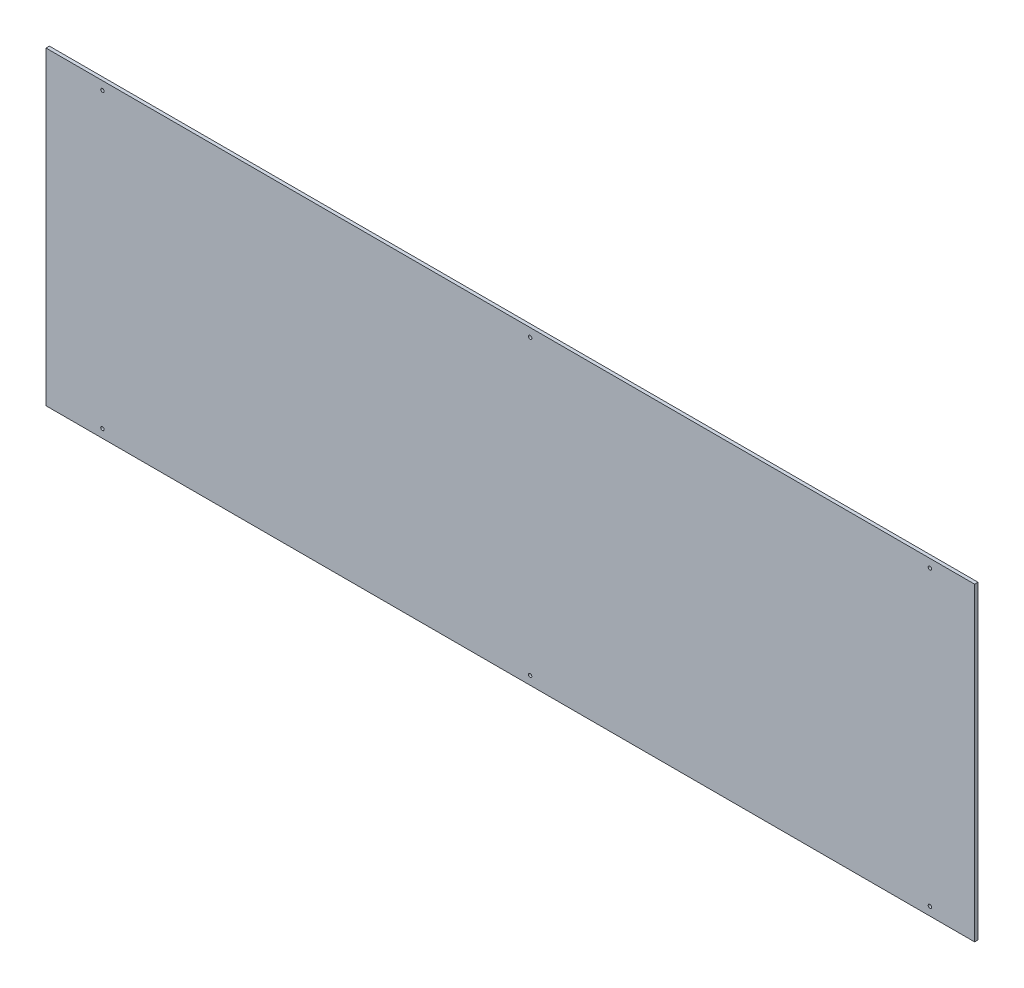
ISO-10303-21;
HEADER;
FILE_DESCRIPTION(('STEP AP214'),'2;1');
FILE_NAME('part.step','',(''),(''),'','','');
FILE_SCHEMA(('AUTOMOTIVE_DESIGN { 1 0 10303 214 1 1 1 1 }'));
ENDSEC;
DATA;
#1=APPLICATION_CONTEXT('core data for automotive mechanical design processes');
#2=APPLICATION_PROTOCOL_DEFINITION('international standard','automotive_design',2000,#1);
#3=PRODUCT_CONTEXT('',#1,'mechanical');
#4=PRODUCT('Part','Part','',(#3));
#5=PRODUCT_RELATED_PRODUCT_CATEGORY('part','',(#4));
#6=PRODUCT_DEFINITION_FORMATION('','',#4);
#7=PRODUCT_DEFINITION_CONTEXT('part definition',#1,'design');
#8=PRODUCT_DEFINITION('design','',#6,#7);
#9=PRODUCT_DEFINITION_SHAPE('','',#8);
#10=(LENGTH_UNIT() NAMED_UNIT(*) SI_UNIT(.MILLI.,.METRE.));
#11=(NAMED_UNIT(*) PLANE_ANGLE_UNIT() SI_UNIT($,.RADIAN.));
#12=(NAMED_UNIT(*) SI_UNIT($,.STERADIAN.) SOLID_ANGLE_UNIT());
#13=UNCERTAINTY_MEASURE_WITH_UNIT(LENGTH_MEASURE(1.E-05),#10,'distance_accuracy_value','');
#14=(GEOMETRIC_REPRESENTATION_CONTEXT(3) GLOBAL_UNCERTAINTY_ASSIGNED_CONTEXT((#13)) GLOBAL_UNIT_ASSIGNED_CONTEXT((#10,
#11,#12)) REPRESENTATION_CONTEXT('',''));
#15=CARTESIAN_POINT('',(0.,0.,0.));
#16=DIRECTION('',(0.,0.,1.));
#17=DIRECTION('',(1.,0.,0.));
#18=AXIS2_PLACEMENT_3D('',#15,#16,#17);
#19=CARTESIAN_POINT('',(-51.8699344230652,328.359791332263,4.));
#20=DIRECTION('',(1.,0.,0.));
#21=DIRECTION('',(0.,1.,0.));
#22=AXIS2_PLACEMENT_3D('',#19,#20,#21);
#23=PLANE('',#22);
#24=DIRECTION('',(0.,-1.,0.));
#25=VECTOR('',#24,1.);
#26=CARTESIAN_POINT('',(-51.8699344230652,328.359791332263,0.));
#27=LINE('',#26,#25);
#28=CARTESIAN_POINT('',(-51.8699344230652,328.359791332263,0.));
#29=VERTEX_POINT('',#28);
#30=CARTESIAN_POINT('',(-51.8699344230652,-38.6402086677368,0.));
#31=VERTEX_POINT('',#30);
#32=EDGE_CURVE('E95',#29,#31,#27,.T.);
#33=ORIENTED_EDGE('',*,*,#32,.T.);
#34=DIRECTION('',(0.,0.,-1.));
#35=VECTOR('',#34,1.);
#36=CARTESIAN_POINT('',(-51.8699344230652,-38.6402086677368,4.));
#37=LINE('',#36,#35);
#38=CARTESIAN_POINT('',(-51.8699344230652,-38.6402086677368,4.));
#39=VERTEX_POINT('',#38);
#40=EDGE_CURVE('E11',#39,#31,#37,.T.);
#41=ORIENTED_EDGE('',*,*,#40,.F.);
#42=DIRECTION('',(0.,-1.,0.));
#43=VECTOR('',#42,1.);
#44=CARTESIAN_POINT('',(-51.8699344230652,328.359791332263,4.));
#45=LINE('',#44,#43);
#46=CARTESIAN_POINT('',(-51.8699344230652,328.359791332263,4.));
#47=VERTEX_POINT('',#46);
#48=EDGE_CURVE('E83',#47,#39,#45,.T.);
#49=ORIENTED_EDGE('',*,*,#48,.F.);
#50=DIRECTION('',(0.,0.,-1.));
#51=VECTOR('',#50,1.);
#52=CARTESIAN_POINT('',(-51.8699344230652,328.359791332263,4.));
#53=LINE('',#52,#51);
#54=EDGE_CURVE('E91',#47,#29,#53,.T.);
#55=ORIENTED_EDGE('',*,*,#54,.T.);
#56=EDGE_LOOP('',(#33,#41,#49,#55));
#57=FACE_BOUND('',#56,.T.);
#58=ADVANCED_FACE('F32',(#57),#23,.F.);
#59=CARTESIAN_POINT('',(-51.8699344230652,-38.6402086677368,4.));
#60=DIRECTION('',(0.,1.,0.));
#61=DIRECTION('',(0.,0.,1.));
#62=AXIS2_PLACEMENT_3D('',#59,#60,#61);
#63=PLANE('',#62);
#64=DIRECTION('',(1.,0.,0.));
#65=VECTOR('',#64,1.);
#66=CARTESIAN_POINT('',(-51.8699344230652,-38.6402086677368,0.));
#67=LINE('',#66,#65);
#68=CARTESIAN_POINT('',(1048.13006557694,-38.6402086677368,0.));
#69=VERTEX_POINT('',#68);
#70=EDGE_CURVE('E87',#31,#69,#67,.T.);
#71=ORIENTED_EDGE('',*,*,#70,.T.);
#72=DIRECTION('',(0.,0.,-1.));
#73=VECTOR('',#72,1.);
#74=CARTESIAN_POINT('',(1048.13006557694,-38.6402086677368,4.));
#75=LINE('',#74,#73);
#76=CARTESIAN_POINT('',(1048.13006557694,-38.6402086677368,4.));
#77=VERTEX_POINT('',#76);
#78=EDGE_CURVE('E40',#77,#69,#75,.T.);
#79=ORIENTED_EDGE('',*,*,#78,.F.);
#80=DIRECTION('',(1.,0.,0.));
#81=VECTOR('',#80,1.);
#82=CARTESIAN_POINT('',(-51.8699344230652,-38.6402086677368,4.));
#83=LINE('',#82,#81);
#84=EDGE_CURVE('E78',#39,#77,#83,.T.);
#85=ORIENTED_EDGE('',*,*,#84,.F.);
#86=ORIENTED_EDGE('',*,*,#40,.T.);
#87=EDGE_LOOP('',(#71,#79,#85,#86));
#88=FACE_BOUND('',#87,.T.);
#89=ADVANCED_FACE('F86',(#88),#63,.F.);
#90=CARTESIAN_POINT('',(1048.13006557694,328.359791332263,4.));
#91=DIRECTION('',(-1.,0.,0.));
#92=DIRECTION('',(0.,0.,1.));
#93=AXIS2_PLACEMENT_3D('',#90,#91,#92);
#94=PLANE('',#93);
#95=DIRECTION('',(0.,1.,0.));
#96=VECTOR('',#95,1.);
#97=CARTESIAN_POINT('',(1048.13006557694,328.359791332263,0.));
#98=LINE('',#97,#96);
#99=CARTESIAN_POINT('',(1048.13006557694,328.359791332263,0.));
#100=VERTEX_POINT('',#99);
#101=EDGE_CURVE('E65',#69,#100,#98,.T.);
#102=ORIENTED_EDGE('',*,*,#101,.T.);
#103=DIRECTION('',(0.,0.,-1.));
#104=VECTOR('',#103,1.);
#105=CARTESIAN_POINT('',(1048.13006557694,328.359791332263,4.));
#106=LINE('',#105,#104);
#107=CARTESIAN_POINT('',(1048.13006557694,328.359791332263,4.));
#108=VERTEX_POINT('',#107);
#109=EDGE_CURVE('E88',#108,#100,#106,.T.);
#110=ORIENTED_EDGE('',*,*,#109,.F.);
#111=DIRECTION('',(0.,1.,0.));
#112=VECTOR('',#111,1.);
#113=CARTESIAN_POINT('',(1048.13006557694,328.359791332263,4.));
#114=LINE('',#113,#112);
#115=EDGE_CURVE('E81',#77,#108,#114,.T.);
#116=ORIENTED_EDGE('',*,*,#115,.F.);
#117=ORIENTED_EDGE('',*,*,#78,.T.);
#118=EDGE_LOOP('',(#102,#110,#116,#117));
#119=FACE_BOUND('',#118,.T.);
#120=ADVANCED_FACE('F89',(#119),#94,.F.);
#121=CARTESIAN_POINT('',(-51.8699344230652,328.359791332263,4.));
#122=DIRECTION('',(0.,-1.,0.));
#123=DIRECTION('',(0.,0.,-1.));
#124=AXIS2_PLACEMENT_3D('',#121,#122,#123);
#125=PLANE('',#124);
#126=DIRECTION('',(-1.,0.,0.));
#127=VECTOR('',#126,1.);
#128=CARTESIAN_POINT('',(-51.8699344230652,328.359791332263,0.));
#129=LINE('',#128,#127);
#130=EDGE_CURVE('E71',#100,#29,#129,.T.);
#131=ORIENTED_EDGE('',*,*,#130,.T.);
#132=ORIENTED_EDGE('',*,*,#54,.F.);
#133=DIRECTION('',(-1.,0.,0.));
#134=VECTOR('',#133,1.);
#135=CARTESIAN_POINT('',(-51.8699344230652,328.359791332263,4.));
#136=LINE('',#135,#134);
#137=EDGE_CURVE('E48',#108,#47,#136,.T.);
#138=ORIENTED_EDGE('',*,*,#137,.F.);
#139=ORIENTED_EDGE('',*,*,#109,.T.);
#140=EDGE_LOOP('',(#131,#132,#138,#139));
#141=FACE_BOUND('',#140,.T.);
#142=ADVANCED_FACE('F103',(#141),#125,.F.);
#143=CARTESIAN_POINT('',(-51.8699344230652,-38.6402086677368,4.));
#144=DIRECTION('',(0.,0.,1.));
#145=DIRECTION('',(1.,0.,0.));
#146=AXIS2_PLACEMENT_3D('',#143,#144,#145);
#147=PLANE('',#146);
#148=CARTESIAN_POINT('',(14.9565094883977,-28.6402086677368,4.));
#149=DIRECTION('',(0.,0.,1.));
#150=DIRECTION('',(1.,0.,0.));
#151=AXIS2_PLACEMENT_3D('',#148,#149,#150);
#152=CIRCLE('',#151,2.);
#153=CARTESIAN_POINT('',(16.9565094883977,-28.6402086677368,4.));
#154=VERTEX_POINT('',#153);
#155=EDGE_CURVE('E139',#154,#154,#152,.T.);
#156=ORIENTED_EDGE('',*,*,#155,.F.);
#157=EDGE_LOOP('',(#156));
#158=FACE_BOUND('',#157,.T.);
#159=CARTESIAN_POINT('',(521.62931709125,-28.6402086677367,4.));
#160=DIRECTION('',(0.,0.,1.));
#161=DIRECTION('',(1.,0.,0.));
#162=AXIS2_PLACEMENT_3D('',#159,#160,#161);
#163=CIRCLE('',#162,2.);
#164=CARTESIAN_POINT('',(523.62931709125,-28.6402086677367,4.));
#165=VERTEX_POINT('',#164);
#166=EDGE_CURVE('E133',#165,#165,#163,.T.);
#167=ORIENTED_EDGE('',*,*,#166,.F.);
#168=EDGE_LOOP('',(#167));
#169=FACE_BOUND('',#168,.T.);
#170=CARTESIAN_POINT('',(995.134492498977,-28.6402086677368,4.));
#171=DIRECTION('',(0.,0.,1.));
#172=DIRECTION('',(1.,0.,0.));
#173=AXIS2_PLACEMENT_3D('',#170,#171,#172);
#174=CIRCLE('',#173,2.);
#175=CARTESIAN_POINT('',(997.134492498977,-28.6402086677368,4.));
#176=VERTEX_POINT('',#175);
#177=EDGE_CURVE('E127',#176,#176,#174,.T.);
#178=ORIENTED_EDGE('',*,*,#177,.F.);
#179=EDGE_LOOP('',(#178));
#180=FACE_BOUND('',#179,.T.);
#181=CARTESIAN_POINT('',(995.134492498977,318.359791332263,4.));
#182=DIRECTION('',(0.,0.,1.));
#183=DIRECTION('',(1.,0.,0.));
#184=AXIS2_PLACEMENT_3D('',#181,#182,#183);
#185=CIRCLE('',#184,2.);
#186=CARTESIAN_POINT('',(997.134492498977,318.359791332263,4.));
#187=VERTEX_POINT('',#186);
#188=EDGE_CURVE('E121',#187,#187,#185,.T.);
#189=ORIENTED_EDGE('',*,*,#188,.F.);
#190=EDGE_LOOP('',(#189));
#191=FACE_BOUND('',#190,.T.);
#192=CARTESIAN_POINT('',(521.62931709125,318.359791332263,4.));
#193=DIRECTION('',(0.,0.,1.));
#194=DIRECTION('',(1.,0.,0.));
#195=AXIS2_PLACEMENT_3D('',#192,#193,#194);
#196=CIRCLE('',#195,2.);
#197=CARTESIAN_POINT('',(523.62931709125,318.359791332263,4.));
#198=VERTEX_POINT('',#197);
#199=EDGE_CURVE('E115',#198,#198,#196,.T.);
#200=ORIENTED_EDGE('',*,*,#199,.F.);
#201=EDGE_LOOP('',(#200));
#202=FACE_BOUND('',#201,.T.);
#203=CARTESIAN_POINT('',(14.9565094883977,318.359791332263,4.));
#204=DIRECTION('',(0.,0.,1.));
#205=DIRECTION('',(1.,0.,0.));
#206=AXIS2_PLACEMENT_3D('',#203,#204,#205);
#207=CIRCLE('',#206,2.);
#208=CARTESIAN_POINT('',(16.9565094883977,318.359791332263,4.));
#209=VERTEX_POINT('',#208);
#210=EDGE_CURVE('E109',#209,#209,#207,.T.);
#211=ORIENTED_EDGE('',*,*,#210,.F.);
#212=EDGE_LOOP('',(#211));
#213=FACE_BOUND('',#212,.T.);
#214=ORIENTED_EDGE('',*,*,#48,.T.);
#215=ORIENTED_EDGE('',*,*,#84,.T.);
#216=ORIENTED_EDGE('',*,*,#115,.T.);
#217=ORIENTED_EDGE('',*,*,#137,.T.);
#218=EDGE_LOOP('',(#214,#215,#216,#217));
#219=FACE_BOUND('',#218,.T.);
#220=ADVANCED_FACE('F79',(#158,#169,#180,#191,#202,#213,#219),#147,.T.);
#221=CARTESIAN_POINT('',(-51.8699344230652,-38.6402086677368,0.));
#222=DIRECTION('',(0.,0.,1.));
#223=DIRECTION('',(1.,0.,0.));
#224=AXIS2_PLACEMENT_3D('',#221,#222,#223);
#225=PLANE('',#224);
#226=CARTESIAN_POINT('',(14.9565094883977,-28.6402086677368,0.));
#227=DIRECTION('',(0.,0.,1.));
#228=DIRECTION('',(1.,0.,0.));
#229=AXIS2_PLACEMENT_3D('',#226,#227,#228);
#230=CIRCLE('',#229,2.);
#231=CARTESIAN_POINT('',(16.9565094883977,-28.6402086677368,0.));
#232=VERTEX_POINT('',#231);
#233=EDGE_CURVE('E136',#232,#232,#230,.T.);
#234=ORIENTED_EDGE('',*,*,#233,.T.);
#235=EDGE_LOOP('',(#234));
#236=FACE_BOUND('',#235,.T.);
#237=CARTESIAN_POINT('',(521.62931709125,-28.6402086677367,0.));
#238=DIRECTION('',(0.,0.,1.));
#239=DIRECTION('',(1.,0.,0.));
#240=AXIS2_PLACEMENT_3D('',#237,#238,#239);
#241=CIRCLE('',#240,2.);
#242=CARTESIAN_POINT('',(523.62931709125,-28.6402086677367,0.));
#243=VERTEX_POINT('',#242);
#244=EDGE_CURVE('E130',#243,#243,#241,.T.);
#245=ORIENTED_EDGE('',*,*,#244,.T.);
#246=EDGE_LOOP('',(#245));
#247=FACE_BOUND('',#246,.T.);
#248=CARTESIAN_POINT('',(995.134492498977,-28.6402086677368,0.));
#249=DIRECTION('',(0.,0.,1.));
#250=DIRECTION('',(1.,0.,0.));
#251=AXIS2_PLACEMENT_3D('',#248,#249,#250);
#252=CIRCLE('',#251,2.);
#253=CARTESIAN_POINT('',(997.134492498977,-28.6402086677368,0.));
#254=VERTEX_POINT('',#253);
#255=EDGE_CURVE('E124',#254,#254,#252,.T.);
#256=ORIENTED_EDGE('',*,*,#255,.T.);
#257=EDGE_LOOP('',(#256));
#258=FACE_BOUND('',#257,.T.);
#259=CARTESIAN_POINT('',(995.134492498977,318.359791332263,0.));
#260=DIRECTION('',(0.,0.,1.));
#261=DIRECTION('',(1.,0.,0.));
#262=AXIS2_PLACEMENT_3D('',#259,#260,#261);
#263=CIRCLE('',#262,2.);
#264=CARTESIAN_POINT('',(997.134492498977,318.359791332263,0.));
#265=VERTEX_POINT('',#264);
#266=EDGE_CURVE('E118',#265,#265,#263,.T.);
#267=ORIENTED_EDGE('',*,*,#266,.T.);
#268=EDGE_LOOP('',(#267));
#269=FACE_BOUND('',#268,.T.);
#270=CARTESIAN_POINT('',(521.62931709125,318.359791332263,0.));
#271=DIRECTION('',(0.,0.,1.));
#272=DIRECTION('',(1.,0.,0.));
#273=AXIS2_PLACEMENT_3D('',#270,#271,#272);
#274=CIRCLE('',#273,2.);
#275=CARTESIAN_POINT('',(523.62931709125,318.359791332263,0.));
#276=VERTEX_POINT('',#275);
#277=EDGE_CURVE('E112',#276,#276,#274,.T.);
#278=ORIENTED_EDGE('',*,*,#277,.T.);
#279=EDGE_LOOP('',(#278));
#280=FACE_BOUND('',#279,.T.);
#281=CARTESIAN_POINT('',(14.9565094883977,318.359791332263,0.));
#282=DIRECTION('',(0.,0.,1.));
#283=DIRECTION('',(1.,0.,0.));
#284=AXIS2_PLACEMENT_3D('',#281,#282,#283);
#285=CIRCLE('',#284,2.);
#286=CARTESIAN_POINT('',(16.9565094883977,318.359791332263,0.));
#287=VERTEX_POINT('',#286);
#288=EDGE_CURVE('E98',#287,#287,#285,.T.);
#289=ORIENTED_EDGE('',*,*,#288,.T.);
#290=EDGE_LOOP('',(#289));
#291=FACE_BOUND('',#290,.T.);
#292=ORIENTED_EDGE('',*,*,#32,.F.);
#293=ORIENTED_EDGE('',*,*,#130,.F.);
#294=ORIENTED_EDGE('',*,*,#101,.F.);
#295=ORIENTED_EDGE('',*,*,#70,.F.);
#296=EDGE_LOOP('',(#292,#293,#294,#295));
#297=FACE_BOUND('',#296,.T.);
#298=ADVANCED_FACE('F106',(#236,#247,#258,#269,#280,#291,#297),#225,.F.);
#299=CARTESIAN_POINT('',(14.9565094883977,318.359791332263,0.));
#300=DIRECTION('',(0.,0.,1.));
#301=DIRECTION('',(1.,0.,0.));
#302=AXIS2_PLACEMENT_3D('',#299,#300,#301);
#303=CYLINDRICAL_SURFACE('',#302,2.);
#304=ORIENTED_EDGE('',*,*,#288,.F.);
#305=EDGE_LOOP('',(#304));
#306=FACE_BOUND('',#305,.T.);
#307=ORIENTED_EDGE('',*,*,#210,.T.);
#308=EDGE_LOOP('',(#307));
#309=FACE_BOUND('',#308,.T.);
#310=ADVANCED_FACE('F167',(#306,#309),#303,.F.);
#311=CARTESIAN_POINT('',(521.62931709125,318.359791332263,0.));
#312=DIRECTION('',(0.,0.,1.));
#313=DIRECTION('',(1.,0.,0.));
#314=AXIS2_PLACEMENT_3D('',#311,#312,#313);
#315=CYLINDRICAL_SURFACE('',#314,2.);
#316=ORIENTED_EDGE('',*,*,#277,.F.);
#317=EDGE_LOOP('',(#316));
#318=FACE_BOUND('',#317,.T.);
#319=ORIENTED_EDGE('',*,*,#199,.T.);
#320=EDGE_LOOP('',(#319));
#321=FACE_BOUND('',#320,.T.);
#322=ADVANCED_FACE('F169',(#318,#321),#315,.F.);
#323=CARTESIAN_POINT('',(995.134492498977,318.359791332263,0.));
#324=DIRECTION('',(0.,0.,1.));
#325=DIRECTION('',(1.,0.,0.));
#326=AXIS2_PLACEMENT_3D('',#323,#324,#325);
#327=CYLINDRICAL_SURFACE('',#326,2.);
#328=ORIENTED_EDGE('',*,*,#266,.F.);
#329=EDGE_LOOP('',(#328));
#330=FACE_BOUND('',#329,.T.);
#331=ORIENTED_EDGE('',*,*,#188,.T.);
#332=EDGE_LOOP('',(#331));
#333=FACE_BOUND('',#332,.T.);
#334=ADVANCED_FACE('F176',(#330,#333),#327,.F.);
#335=CARTESIAN_POINT('',(995.134492498977,-28.6402086677368,0.));
#336=DIRECTION('',(0.,0.,1.));
#337=DIRECTION('',(1.,0.,0.));
#338=AXIS2_PLACEMENT_3D('',#335,#336,#337);
#339=CYLINDRICAL_SURFACE('',#338,2.);
#340=ORIENTED_EDGE('',*,*,#255,.F.);
#341=EDGE_LOOP('',(#340));
#342=FACE_BOUND('',#341,.T.);
#343=ORIENTED_EDGE('',*,*,#177,.T.);
#344=EDGE_LOOP('',(#343));
#345=FACE_BOUND('',#344,.T.);
#346=ADVANCED_FACE('F222',(#342,#345),#339,.F.);
#347=CARTESIAN_POINT('',(521.62931709125,-28.6402086677367,0.));
#348=DIRECTION('',(0.,0.,1.));
#349=DIRECTION('',(1.,0.,0.));
#350=AXIS2_PLACEMENT_3D('',#347,#348,#349);
#351=CYLINDRICAL_SURFACE('',#350,2.);
#352=ORIENTED_EDGE('',*,*,#244,.F.);
#353=EDGE_LOOP('',(#352));
#354=FACE_BOUND('',#353,.T.);
#355=ORIENTED_EDGE('',*,*,#166,.T.);
#356=EDGE_LOOP('',(#355));
#357=FACE_BOUND('',#356,.T.);
#358=ADVANCED_FACE('F150',(#354,#357),#351,.F.);
#359=CARTESIAN_POINT('',(14.9565094883977,-28.6402086677368,0.));
#360=DIRECTION('',(0.,0.,1.));
#361=DIRECTION('',(1.,0.,0.));
#362=AXIS2_PLACEMENT_3D('',#359,#360,#361);
#363=CYLINDRICAL_SURFACE('',#362,2.);
#364=ORIENTED_EDGE('',*,*,#233,.F.);
#365=EDGE_LOOP('',(#364));
#366=FACE_BOUND('',#365,.T.);
#367=ORIENTED_EDGE('',*,*,#155,.T.);
#368=EDGE_LOOP('',(#367));
#369=FACE_BOUND('',#368,.T.);
#370=ADVANCED_FACE('F147',(#366,#369),#363,.F.);
#371=CLOSED_SHELL('',(#58,#89,#120,#142,#220,#298,#310,#322,#334,#346,#358,#370));
#372=MANIFOLD_SOLID_BREP('B2',#371);
#373=ADVANCED_BREP_SHAPE_REPRESENTATION('',(#18,#372),#14);
#374=SHAPE_DEFINITION_REPRESENTATION(#9,#373);
ENDSEC;
END-ISO-10303-21;
